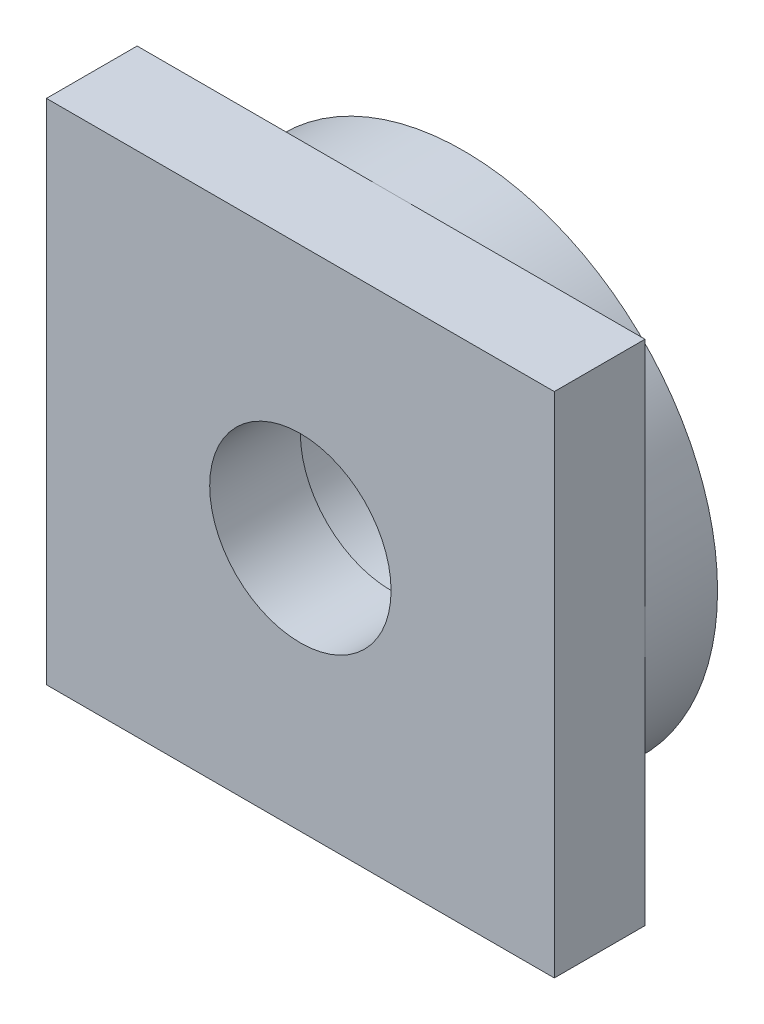
ISO-10303-21;
HEADER;
FILE_DESCRIPTION(('STEP AP214'),'2;1');
FILE_NAME('part.step','',(''),(''),'','','');
FILE_SCHEMA(('AUTOMOTIVE_DESIGN { 1 0 10303 214 1 1 1 1 }'));
ENDSEC;
DATA;
#1=APPLICATION_CONTEXT('core data for automotive mechanical design processes');
#2=APPLICATION_PROTOCOL_DEFINITION('international standard','automotive_design',2000,#1);
#3=PRODUCT_CONTEXT('',#1,'mechanical');
#4=PRODUCT('Part','Part','',(#3));
#5=PRODUCT_RELATED_PRODUCT_CATEGORY('part','',(#4));
#6=PRODUCT_DEFINITION_FORMATION('','',#4);
#7=PRODUCT_DEFINITION_CONTEXT('part definition',#1,'design');
#8=PRODUCT_DEFINITION('design','',#6,#7);
#9=PRODUCT_DEFINITION_SHAPE('','',#8);
#10=(LENGTH_UNIT() NAMED_UNIT(*) SI_UNIT(.MILLI.,.METRE.));
#11=(NAMED_UNIT(*) PLANE_ANGLE_UNIT() SI_UNIT($,.RADIAN.));
#12=(NAMED_UNIT(*) SI_UNIT($,.STERADIAN.) SOLID_ANGLE_UNIT());
#13=UNCERTAINTY_MEASURE_WITH_UNIT(LENGTH_MEASURE(1.E-05),#10,'distance_accuracy_value','');
#14=(GEOMETRIC_REPRESENTATION_CONTEXT(3) GLOBAL_UNCERTAINTY_ASSIGNED_CONTEXT((#13)) GLOBAL_UNIT_ASSIGNED_CONTEXT((#10,
#11,#12)) REPRESENTATION_CONTEXT('',''));
#15=CARTESIAN_POINT('',(0.,0.,0.));
#16=DIRECTION('',(0.,0.,1.));
#17=DIRECTION('',(1.,0.,0.));
#18=AXIS2_PLACEMENT_3D('',#15,#16,#17);
#19=CARTESIAN_POINT('',(0.,0.,22.));
#20=DIRECTION('',(0.,0.,-1.));
#21=DIRECTION('',(-1.,0.,0.));
#22=AXIS2_PLACEMENT_3D('',#19,#20,#21);
#23=PLANE('',#22);
#24=CARTESIAN_POINT('',(0.,0.,22.));
#25=DIRECTION('',(0.,0.,-1.));
#26=DIRECTION('',(-1.,0.,0.));
#27=AXIS2_PLACEMENT_3D('',#24,#25,#26);
#28=CIRCLE('',#27,10.);
#29=CARTESIAN_POINT('',(-10.,0.,22.));
#30=VERTEX_POINT('',#29);
#31=EDGE_CURVE('E200',#30,#30,#28,.F.);
#32=ORIENTED_EDGE('',*,*,#31,.T.);
#33=EDGE_LOOP('',(#32));
#34=FACE_BOUND('',#33,.T.);
#35=CARTESIAN_POINT('',(0.,0.,22.));
#36=DIRECTION('',(0.,0.,-1.));
#37=DIRECTION('',(-1.,0.,0.));
#38=AXIS2_PLACEMENT_3D('',#35,#36,#37);
#39=CIRCLE('',#38,11.);
#40=CARTESIAN_POINT('',(-11.,0.,22.));
#41=VERTEX_POINT('',#40);
#42=EDGE_CURVE('E11',#41,#41,#39,.F.);
#43=ORIENTED_EDGE('',*,*,#42,.F.);
#44=EDGE_LOOP('',(#43));
#45=FACE_BOUND('',#44,.T.);
#46=ADVANCED_FACE('F35',(#34,#45),#23,.T.);
#47=CARTESIAN_POINT('',(0.,0.,22.));
#48=DIRECTION('',(0.,0.,-1.));
#49=DIRECTION('',(-1.,0.,0.));
#50=AXIS2_PLACEMENT_3D('',#47,#48,#49);
#51=CYLINDRICAL_SURFACE('',#50,28.);
#52=CARTESIAN_POINT('',(0.,0.,14.));
#53=DIRECTION('',(0.,0.,1.));
#54=DIRECTION('',(1.,0.,0.));
#55=AXIS2_PLACEMENT_3D('',#52,#53,#54);
#56=CIRCLE('',#55,28.);
#57=CARTESIAN_POINT('',(28.,0.,14.));
#58=VERTEX_POINT('',#57);
#59=EDGE_CURVE('E204',#58,#58,#56,.T.);
#60=ORIENTED_EDGE('',*,*,#59,.T.);
#61=EDGE_LOOP('',(#60));
#62=FACE_BOUND('',#61,.T.);
#63=CARTESIAN_POINT('',(0.,0.,22.));
#64=DIRECTION('',(0.,0.,1.));
#65=DIRECTION('',(1.,0.,0.));
#66=AXIS2_PLACEMENT_3D('',#63,#64,#65);
#67=CIRCLE('',#66,28.);
#68=CARTESIAN_POINT('',(28.,0.,22.));
#69=VERTEX_POINT('',#68);
#70=CARTESIAN_POINT('',(0.,28.,22.));
#71=VERTEX_POINT('',#70);
#72=EDGE_CURVE('E43',#69,#71,#67,.T.);
#73=ORIENTED_EDGE('',*,*,#72,.F.);
#74=CARTESIAN_POINT('',(0.,-28.,22.));
#75=VERTEX_POINT('',#74);
#76=EDGE_CURVE('E50',#75,#69,#67,.T.);
#77=ORIENTED_EDGE('',*,*,#76,.F.);
#78=CARTESIAN_POINT('',(-28.,0.,22.));
#79=VERTEX_POINT('',#78);
#80=EDGE_CURVE('E54',#79,#75,#67,.T.);
#81=ORIENTED_EDGE('',*,*,#80,.F.);
#82=EDGE_CURVE('E118',#71,#79,#67,.T.);
#83=ORIENTED_EDGE('',*,*,#82,.F.);
#84=EDGE_LOOP('',(#73,#77,#81,#83));
#85=FACE_BOUND('',#84,.T.);
#86=ADVANCED_FACE('F37',(#62,#85),#51,.T.);
#87=DIRECTION('',(0.,1.,0.));
#88=VECTOR('',#87,1.);
#89=CARTESIAN_POINT('',(28.,-28.,22.));
#90=LINE('',#89,#88);
#91=CARTESIAN_POINT('',(28.,28.,22.));
#92=VERTEX_POINT('',#91);
#93=EDGE_CURVE('E111',#69,#92,#90,.T.);
#94=ORIENTED_EDGE('',*,*,#93,.F.);
#95=ORIENTED_EDGE('',*,*,#72,.T.);
#96=DIRECTION('',(-1.,0.,0.));
#97=VECTOR('',#96,1.);
#98=CARTESIAN_POINT('',(-28.,28.,22.));
#99=LINE('',#98,#97);
#100=EDGE_CURVE('E150',#92,#71,#99,.T.);
#101=ORIENTED_EDGE('',*,*,#100,.F.);
#102=EDGE_LOOP('',(#94,#95,#101));
#103=FACE_BOUND('',#102,.T.);
#104=ADVANCED_FACE('F155',(#103),#23,.T.);
#105=CARTESIAN_POINT('',(-28.,28.,22.));
#106=VERTEX_POINT('',#105);
#107=EDGE_CURVE('E149',#71,#106,#99,.T.);
#108=ORIENTED_EDGE('',*,*,#107,.F.);
#109=ORIENTED_EDGE('',*,*,#82,.T.);
#110=DIRECTION('',(0.,-1.,0.));
#111=VECTOR('',#110,1.);
#112=CARTESIAN_POINT('',(-28.,-28.,22.));
#113=LINE('',#112,#111);
#114=EDGE_CURVE('E137',#106,#79,#113,.T.);
#115=ORIENTED_EDGE('',*,*,#114,.F.);
#116=EDGE_LOOP('',(#108,#109,#115));
#117=FACE_BOUND('',#116,.T.);
#118=ADVANCED_FACE('F153',(#117),#23,.T.);
#119=CARTESIAN_POINT('',(-28.,-28.,22.));
#120=VERTEX_POINT('',#119);
#121=EDGE_CURVE('E129',#79,#120,#113,.T.);
#122=ORIENTED_EDGE('',*,*,#121,.F.);
#123=ORIENTED_EDGE('',*,*,#80,.T.);
#124=DIRECTION('',(1.,0.,0.));
#125=VECTOR('',#124,1.);
#126=CARTESIAN_POINT('',(-28.,-28.,22.));
#127=LINE('',#126,#125);
#128=EDGE_CURVE('E106',#120,#75,#127,.T.);
#129=ORIENTED_EDGE('',*,*,#128,.F.);
#130=EDGE_LOOP('',(#122,#123,#129));
#131=FACE_BOUND('',#130,.T.);
#132=ADVANCED_FACE('F127',(#131),#23,.T.);
#133=CARTESIAN_POINT('',(28.,-28.,32.));
#134=DIRECTION('',(-1.,0.,0.));
#135=DIRECTION('',(0.,0.,1.));
#136=AXIS2_PLACEMENT_3D('',#133,#134,#135);
#137=PLANE('',#136);
#138=CARTESIAN_POINT('',(28.,-28.,22.));
#139=VERTEX_POINT('',#138);
#140=EDGE_CURVE('E135',#139,#69,#90,.T.);
#141=ORIENTED_EDGE('',*,*,#140,.T.);
#142=ORIENTED_EDGE('',*,*,#93,.T.);
#143=DIRECTION('',(0.,0.,-1.));
#144=VECTOR('',#143,1.);
#145=CARTESIAN_POINT('',(28.,28.,32.));
#146=LINE('',#145,#144);
#147=CARTESIAN_POINT('',(28.,28.,32.));
#148=VERTEX_POINT('',#147);
#149=EDGE_CURVE('E91',#148,#92,#146,.T.);
#150=ORIENTED_EDGE('',*,*,#149,.F.);
#151=DIRECTION('',(0.,1.,0.));
#152=VECTOR('',#151,1.);
#153=CARTESIAN_POINT('',(28.,-28.,32.));
#154=LINE('',#153,#152);
#155=CARTESIAN_POINT('',(28.,-28.,32.));
#156=VERTEX_POINT('',#155);
#157=EDGE_CURVE('E97',#156,#148,#154,.T.);
#158=ORIENTED_EDGE('',*,*,#157,.F.);
#159=DIRECTION('',(0.,0.,-1.));
#160=VECTOR('',#159,1.);
#161=CARTESIAN_POINT('',(28.,-28.,32.));
#162=LINE('',#161,#160);
#163=EDGE_CURVE('E145',#156,#139,#162,.T.);
#164=ORIENTED_EDGE('',*,*,#163,.T.);
#165=EDGE_LOOP('',(#141,#142,#150,#158,#164));
#166=FACE_BOUND('',#165,.T.);
#167=ADVANCED_FACE('F109',(#166),#137,.F.);
#168=CARTESIAN_POINT('',(-28.,28.,32.));
#169=DIRECTION('',(0.,-1.,0.));
#170=DIRECTION('',(0.,0.,-1.));
#171=AXIS2_PLACEMENT_3D('',#168,#169,#170);
#172=PLANE('',#171);
#173=ORIENTED_EDGE('',*,*,#100,.T.);
#174=ORIENTED_EDGE('',*,*,#107,.T.);
#175=DIRECTION('',(0.,0.,-1.));
#176=VECTOR('',#175,1.);
#177=CARTESIAN_POINT('',(-28.,28.,32.));
#178=LINE('',#177,#176);
#179=CARTESIAN_POINT('',(-28.,28.,32.));
#180=VERTEX_POINT('',#179);
#181=EDGE_CURVE('E93',#180,#106,#178,.T.);
#182=ORIENTED_EDGE('',*,*,#181,.F.);
#183=DIRECTION('',(-1.,0.,0.));
#184=VECTOR('',#183,1.);
#185=CARTESIAN_POINT('',(-28.,28.,32.));
#186=LINE('',#185,#184);
#187=EDGE_CURVE('E86',#148,#180,#186,.T.);
#188=ORIENTED_EDGE('',*,*,#187,.F.);
#189=ORIENTED_EDGE('',*,*,#149,.T.);
#190=EDGE_LOOP('',(#173,#174,#182,#188,#189));
#191=FACE_BOUND('',#190,.T.);
#192=ADVANCED_FACE('F89',(#191),#172,.F.);
#193=CARTESIAN_POINT('',(-28.,-28.,32.));
#194=DIRECTION('',(1.,0.,0.));
#195=DIRECTION('',(0.,0.,-1.));
#196=AXIS2_PLACEMENT_3D('',#193,#194,#195);
#197=PLANE('',#196);
#198=ORIENTED_EDGE('',*,*,#114,.T.);
#199=ORIENTED_EDGE('',*,*,#121,.T.);
#200=DIRECTION('',(0.,0.,-1.));
#201=VECTOR('',#200,1.);
#202=CARTESIAN_POINT('',(-28.,-28.,32.));
#203=LINE('',#202,#201);
#204=CARTESIAN_POINT('',(-28.,-28.,32.));
#205=VERTEX_POINT('',#204);
#206=EDGE_CURVE('E114',#205,#120,#203,.T.);
#207=ORIENTED_EDGE('',*,*,#206,.F.);
#208=DIRECTION('',(0.,-1.,0.));
#209=VECTOR('',#208,1.);
#210=CARTESIAN_POINT('',(-28.,-28.,32.));
#211=LINE('',#210,#209);
#212=EDGE_CURVE('E96',#180,#205,#211,.T.);
#213=ORIENTED_EDGE('',*,*,#212,.F.);
#214=ORIENTED_EDGE('',*,*,#181,.T.);
#215=EDGE_LOOP('',(#198,#199,#207,#213,#214));
#216=FACE_BOUND('',#215,.T.);
#217=ADVANCED_FACE('F152',(#216),#197,.F.);
#218=CARTESIAN_POINT('',(-28.,-28.,32.));
#219=DIRECTION('',(0.,1.,0.));
#220=DIRECTION('',(0.,0.,1.));
#221=AXIS2_PLACEMENT_3D('',#218,#219,#220);
#222=PLANE('',#221);
#223=ORIENTED_EDGE('',*,*,#128,.T.);
#224=EDGE_CURVE('E133',#75,#139,#127,.T.);
#225=ORIENTED_EDGE('',*,*,#224,.T.);
#226=ORIENTED_EDGE('',*,*,#163,.F.);
#227=DIRECTION('',(1.,0.,0.));
#228=VECTOR('',#227,1.);
#229=CARTESIAN_POINT('',(-28.,-28.,32.));
#230=LINE('',#229,#228);
#231=EDGE_CURVE('E102',#205,#156,#230,.T.);
#232=ORIENTED_EDGE('',*,*,#231,.F.);
#233=ORIENTED_EDGE('',*,*,#206,.T.);
#234=EDGE_LOOP('',(#223,#225,#226,#232,#233));
#235=FACE_BOUND('',#234,.T.);
#236=ADVANCED_FACE('F140',(#235),#222,.F.);
#237=CARTESIAN_POINT('',(0.,0.,32.));
#238=DIRECTION('',(0.,0.,-1.));
#239=DIRECTION('',(-1.,0.,0.));
#240=AXIS2_PLACEMENT_3D('',#237,#238,#239);
#241=PLANE('',#240);
#242=CARTESIAN_POINT('',(0.,0.,32.));
#243=DIRECTION('',(0.,0.,1.));
#244=DIRECTION('',(1.,0.,0.));
#245=AXIS2_PLACEMENT_3D('',#242,#243,#244);
#246=CIRCLE('',#245,10.);
#247=CARTESIAN_POINT('',(10.,0.,32.));
#248=VERTEX_POINT('',#247);
#249=EDGE_CURVE('E198',#248,#248,#246,.T.);
#250=ORIENTED_EDGE('',*,*,#249,.F.);
#251=EDGE_LOOP('',(#250));
#252=FACE_BOUND('',#251,.T.);
#253=ORIENTED_EDGE('',*,*,#157,.T.);
#254=ORIENTED_EDGE('',*,*,#187,.T.);
#255=ORIENTED_EDGE('',*,*,#212,.T.);
#256=ORIENTED_EDGE('',*,*,#231,.T.);
#257=EDGE_LOOP('',(#253,#254,#255,#256));
#258=FACE_BOUND('',#257,.T.);
#259=ADVANCED_FACE('F100',(#252,#258),#241,.F.);
#260=ORIENTED_EDGE('',*,*,#224,.F.);
#261=ORIENTED_EDGE('',*,*,#76,.T.);
#262=ORIENTED_EDGE('',*,*,#140,.F.);
#263=EDGE_LOOP('',(#260,#261,#262));
#264=FACE_BOUND('',#263,.T.);
#265=ADVANCED_FACE('F134',(#264),#23,.T.);
#266=CARTESIAN_POINT('',(0.,0.,14.));
#267=DIRECTION('',(0.,0.,1.));
#268=DIRECTION('',(1.,0.,0.));
#269=AXIS2_PLACEMENT_3D('',#266,#267,#268);
#270=PLANE('',#269);
#271=ORIENTED_EDGE('',*,*,#59,.F.);
#272=EDGE_LOOP('',(#271));
#273=FACE_BOUND('',#272,.T.);
#274=CARTESIAN_POINT('',(0.,0.,14.));
#275=DIRECTION('',(0.,0.,-1.));
#276=DIRECTION('',(-1.,0.,0.));
#277=AXIS2_PLACEMENT_3D('',#274,#275,#276);
#278=CIRCLE('',#277,11.);
#279=CARTESIAN_POINT('',(-11.,0.,14.));
#280=VERTEX_POINT('',#279);
#281=EDGE_CURVE('E201',#280,#280,#278,.T.);
#282=ORIENTED_EDGE('',*,*,#281,.F.);
#283=EDGE_LOOP('',(#282));
#284=FACE_BOUND('',#283,.T.);
#285=ADVANCED_FACE('F174',(#273,#284),#270,.F.);
#286=CARTESIAN_POINT('',(0.,0.,14.));
#287=DIRECTION('',(0.,0.,1.));
#288=DIRECTION('',(1.,0.,0.));
#289=AXIS2_PLACEMENT_3D('',#286,#287,#288);
#290=CYLINDRICAL_SURFACE('',#289,11.);
#291=ORIENTED_EDGE('',*,*,#281,.T.);
#292=EDGE_LOOP('',(#291));
#293=FACE_BOUND('',#292,.T.);
#294=ORIENTED_EDGE('',*,*,#42,.T.);
#295=EDGE_LOOP('',(#294));
#296=FACE_BOUND('',#295,.T.);
#297=ADVANCED_FACE('F180',(#293,#296),#290,.F.);
#298=CARTESIAN_POINT('',(0.,0.,-6.2842712474619));
#299=DIRECTION('',(0.,0.,1.));
#300=DIRECTION('',(1.,0.,0.));
#301=AXIS2_PLACEMENT_3D('',#298,#299,#300);
#302=CYLINDRICAL_SURFACE('',#301,10.);
#303=ORIENTED_EDGE('',*,*,#249,.T.);
#304=EDGE_LOOP('',(#303));
#305=FACE_BOUND('',#304,.T.);
#306=ORIENTED_EDGE('',*,*,#31,.F.);
#307=EDGE_LOOP('',(#306));
#308=FACE_BOUND('',#307,.T.);
#309=ADVANCED_FACE('F191',(#305,#308),#302,.F.);
#310=CLOSED_SHELL('',(#46,#86,#104,#118,#132,#167,#192,#217,#236,#259,#265,#285,#297,#309));
#311=MANIFOLD_SOLID_BREP('B2',#310);
#312=ADVANCED_BREP_SHAPE_REPRESENTATION('',(#18,#311),#14);
#313=SHAPE_DEFINITION_REPRESENTATION(#9,#312);
ENDSEC;
END-ISO-10303-21;
